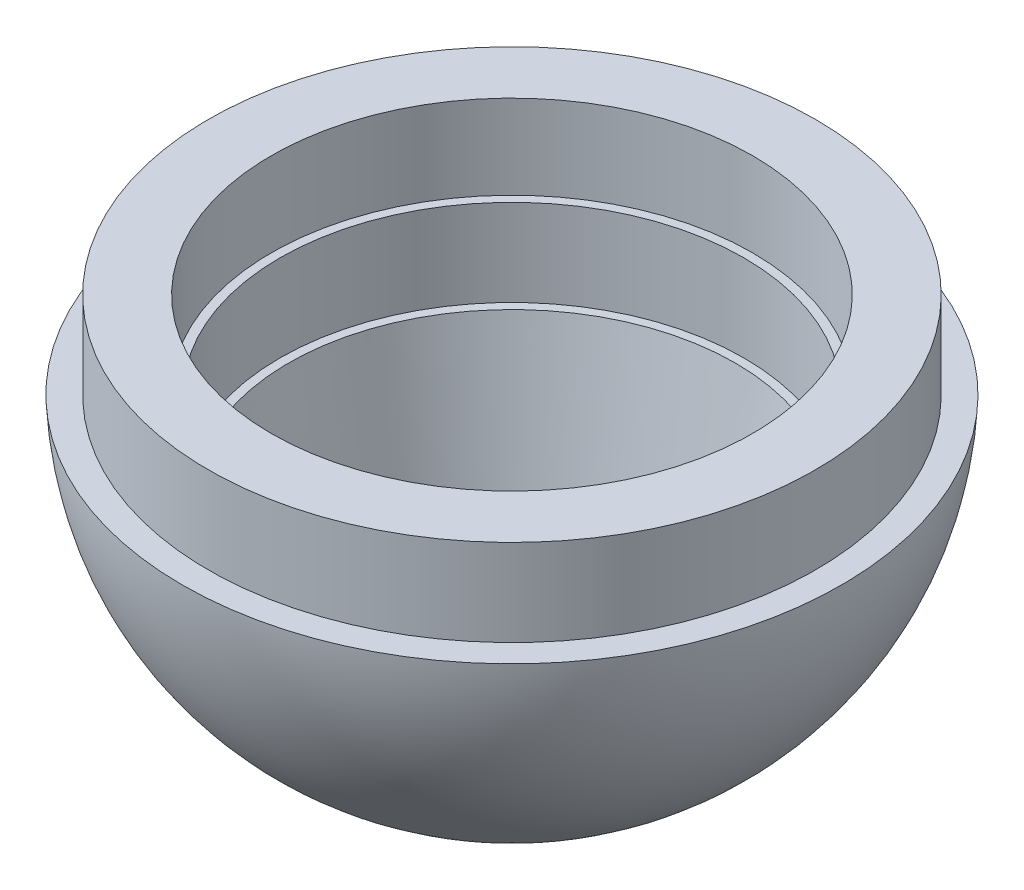
ISO-10303-21;
HEADER;
FILE_DESCRIPTION(('STEP AP214'),'2;1');
FILE_NAME('part.step','',(''),(''),'','','');
FILE_SCHEMA(('AUTOMOTIVE_DESIGN { 1 0 10303 214 1 1 1 1 }'));
ENDSEC;
DATA;
#1=APPLICATION_CONTEXT('core data for automotive mechanical design processes');
#2=APPLICATION_PROTOCOL_DEFINITION('international standard','automotive_design',2000,#1);
#3=PRODUCT_CONTEXT('',#1,'mechanical');
#4=PRODUCT('Part','Part','',(#3));
#5=PRODUCT_RELATED_PRODUCT_CATEGORY('part','',(#4));
#6=PRODUCT_DEFINITION_FORMATION('','',#4);
#7=PRODUCT_DEFINITION_CONTEXT('part definition',#1,'design');
#8=PRODUCT_DEFINITION('design','',#6,#7);
#9=PRODUCT_DEFINITION_SHAPE('','',#8);
#10=(LENGTH_UNIT() NAMED_UNIT(*) SI_UNIT(.MILLI.,.METRE.));
#11=(NAMED_UNIT(*) PLANE_ANGLE_UNIT() SI_UNIT($,.RADIAN.));
#12=(NAMED_UNIT(*) SI_UNIT($,.STERADIAN.) SOLID_ANGLE_UNIT());
#13=UNCERTAINTY_MEASURE_WITH_UNIT(LENGTH_MEASURE(1.E-05),#10,'distance_accuracy_value','');
#14=(GEOMETRIC_REPRESENTATION_CONTEXT(3) GLOBAL_UNCERTAINTY_ASSIGNED_CONTEXT((#13)) GLOBAL_UNIT_ASSIGNED_CONTEXT((#10,
#11,#12)) REPRESENTATION_CONTEXT('',''));
#15=CARTESIAN_POINT('',(0.,0.,0.));
#16=DIRECTION('',(0.,0.,1.));
#17=DIRECTION('',(1.,0.,0.));
#18=AXIS2_PLACEMENT_3D('',#15,#16,#17);
#19=CARTESIAN_POINT('',(0.,0.,0.));
#20=DIRECTION('',(0.,-1.,0.));
#21=DIRECTION('',(0.,0.,-1.));
#22=AXIS2_PLACEMENT_3D('',#19,#20,#21);
#23=CYLINDRICAL_SURFACE('',#22,27.75);
#24=CARTESIAN_POINT('',(0.,8.2,0.));
#25=DIRECTION('',(0.,-1.,0.));
#26=DIRECTION('',(0.,0.,-1.));
#27=AXIS2_PLACEMENT_3D('',#24,#25,#26);
#28=CIRCLE('',#27,27.75);
#29=CARTESIAN_POINT('',(0.,8.2,-27.75));
#30=VERTEX_POINT('',#29);
#31=EDGE_CURVE('E68',#30,#30,#28,.T.);
#32=ORIENTED_EDGE('',*,*,#31,.F.);
#33=EDGE_LOOP('',(#32));
#34=FACE_BOUND('',#33,.T.);
#35=CARTESIAN_POINT('',(0.,-1.5,0.));
#36=DIRECTION('',(0.,-1.,0.));
#37=DIRECTION('',(0.,0.,-1.));
#38=AXIS2_PLACEMENT_3D('',#35,#36,#37);
#39=CIRCLE('',#38,27.75);
#40=CARTESIAN_POINT('',(0.,-1.5,-27.75));
#41=VERTEX_POINT('',#40);
#42=EDGE_CURVE('E10',#41,#41,#39,.T.);
#43=ORIENTED_EDGE('',*,*,#42,.T.);
#44=EDGE_LOOP('',(#43));
#45=FACE_BOUND('',#44,.T.);
#46=ADVANCED_FACE('F31',(#34,#45),#23,.F.);
#47=CARTESIAN_POINT('',(0.,-1.5,27.75));
#48=DIRECTION('',(0.,-1.,0.));
#49=DIRECTION('',(0.,0.,-1.));
#50=AXIS2_PLACEMENT_3D('',#47,#48,#49);
#51=PLANE('',#50);
#52=ORIENTED_EDGE('',*,*,#42,.F.);
#53=EDGE_LOOP('',(#52));
#54=FACE_BOUND('',#53,.T.);
#55=CARTESIAN_POINT('',(0.,-1.5,0.));
#56=DIRECTION('',(0.,-1.,0.));
#57=DIRECTION('',(0.,0.,-1.));
#58=AXIS2_PLACEMENT_3D('',#55,#56,#57);
#59=CIRCLE('',#58,26.75);
#60=CARTESIAN_POINT('',(0.,-1.5,-26.75));
#61=VERTEX_POINT('',#60);
#62=EDGE_CURVE('E37',#61,#61,#59,.T.);
#63=ORIENTED_EDGE('',*,*,#62,.T.);
#64=EDGE_LOOP('',(#63));
#65=FACE_BOUND('',#64,.T.);
#66=ADVANCED_FACE('F75',(#54,#65),#51,.F.);
#67=CARTESIAN_POINT('',(0.,0.,0.));
#68=DIRECTION('',(0.,-1.,0.));
#69=DIRECTION('',(0.,0.,-1.));
#70=AXIS2_PLACEMENT_3D('',#67,#68,#69);
#71=CYLINDRICAL_SURFACE('',#70,26.75);
#72=ORIENTED_EDGE('',*,*,#62,.F.);
#73=EDGE_LOOP('',(#72));
#74=FACE_BOUND('',#73,.T.);
#75=CARTESIAN_POINT('',(0.,-11.5,0.));
#76=DIRECTION('',(0.,-1.,0.));
#77=DIRECTION('',(0.,0.,-1.));
#78=AXIS2_PLACEMENT_3D('',#75,#76,#77);
#79=CIRCLE('',#78,26.75);
#80=CARTESIAN_POINT('',(0.,-11.5,-26.75));
#81=VERTEX_POINT('',#80);
#82=EDGE_CURVE('E41',#81,#81,#79,.T.);
#83=ORIENTED_EDGE('',*,*,#82,.T.);
#84=EDGE_LOOP('',(#83));
#85=FACE_BOUND('',#84,.T.);
#86=ADVANCED_FACE('F79',(#74,#85),#71,.F.);
#87=CARTESIAN_POINT('',(0.,-11.5,26.75));
#88=DIRECTION('',(0.,-1.,0.));
#89=DIRECTION('',(0.,0.,-1.));
#90=AXIS2_PLACEMENT_3D('',#87,#88,#89);
#91=PLANE('',#90);
#92=ORIENTED_EDGE('',*,*,#82,.F.);
#93=EDGE_LOOP('',(#92));
#94=FACE_BOUND('',#93,.T.);
#95=CARTESIAN_POINT('',(0.,-11.5,0.));
#96=DIRECTION('',(0.,-1.,0.));
#97=DIRECTION('',(0.,0.,-1.));
#98=AXIS2_PLACEMENT_3D('',#95,#96,#97);
#99=CIRCLE('',#98,25.75);
#100=CARTESIAN_POINT('',(0.,-11.5,-25.75));
#101=VERTEX_POINT('',#100);
#102=EDGE_CURVE('E45',#101,#101,#99,.T.);
#103=ORIENTED_EDGE('',*,*,#102,.T.);
#104=EDGE_LOOP('',(#103));
#105=FACE_BOUND('',#104,.T.);
#106=ADVANCED_FACE('F84',(#94,#105),#91,.F.);
#107=CARTESIAN_POINT('',(0.,-28.2472963553339,0.));
#108=DIRECTION('',(0.,1.,0.));
#109=DIRECTION('',(0.,0.,1.));
#110=AXIS2_PLACEMENT_3D('',#107,#108,#109);
#111=CONICAL_SURFACE('',#110,22.7969997986341,0.174532925199434);
#112=ORIENTED_EDGE('',*,*,#102,.F.);
#113=EDGE_LOOP('',(#112));
#114=FACE_BOUND('',#113,.T.);
#115=CARTESIAN_POINT('',(0.,-28.2472963553339,0.));
#116=DIRECTION('',(0.,-1.,0.));
#117=DIRECTION('',(0.,0.,-1.));
#118=AXIS2_PLACEMENT_3D('',#115,#116,#117);
#119=CIRCLE('',#118,22.7969997986341);
#120=CARTESIAN_POINT('',(0.,-28.2472963553339,-22.7969997986341));
#121=VERTEX_POINT('',#120);
#122=EDGE_CURVE('E50',#121,#121,#119,.T.);
#123=ORIENTED_EDGE('',*,*,#122,.T.);
#124=EDGE_LOOP('',(#123));
#125=FACE_BOUND('',#124,.T.);
#126=ADVANCED_FACE('F90',(#114,#125),#111,.F.);
#127=CARTESIAN_POINT('',(0.,-27.9,0.));
#128=DIRECTION('',(0.,-1.,0.));
#129=DIRECTION('',(0.,0.,-1.));
#130=AXIS2_PLACEMENT_3D('',#127,#128,#129);
#131=TOROIDAL_SURFACE('',#130,20.8273842926097,2.);
#132=ORIENTED_EDGE('',*,*,#122,.F.);
#133=EDGE_LOOP('',(#132));
#134=FACE_BOUND('',#133,.T.);
#135=CARTESIAN_POINT('',(0.,-29.9,0.));
#136=DIRECTION('',(0.,-1.,0.));
#137=DIRECTION('',(0.,0.,-1.));
#138=AXIS2_PLACEMENT_3D('',#135,#136,#137);
#139=CIRCLE('',#138,20.8273842926097);
#140=CARTESIAN_POINT('',(0.,-29.9,-20.8273842926097));
#141=VERTEX_POINT('',#140);
#142=EDGE_CURVE('E53',#141,#141,#139,.T.);
#143=ORIENTED_EDGE('',*,*,#142,.T.);
#144=EDGE_LOOP('',(#143));
#145=FACE_BOUND('',#144,.T.);
#146=ADVANCED_FACE('F94',(#134,#145),#131,.F.);
#147=CARTESIAN_POINT('',(0.,-29.9,20.8273842926097));
#148=DIRECTION('',(0.,-1.,0.));
#149=DIRECTION('',(0.,0.,-1.));
#150=AXIS2_PLACEMENT_3D('',#147,#148,#149);
#151=PLANE('',#150);
#152=ORIENTED_EDGE('',*,*,#142,.F.);
#153=EDGE_LOOP('',(#152));
#154=FACE_BOUND('',#153,.T.);
#155=ADVANCED_FACE('F98',(#154),#151,.F.);
#156=CARTESIAN_POINT('',(0.,-32.4,19.9369004612051));
#157=DIRECTION('',(0.,1.,0.));
#158=DIRECTION('',(0.,0.,1.));
#159=AXIS2_PLACEMENT_3D('',#156,#157,#158);
#160=PLANE('',#159);
#161=CARTESIAN_POINT('',(0.,-32.4,0.));
#162=DIRECTION('',(0.,-1.,0.));
#163=DIRECTION('',(0.,0.,-1.));
#164=AXIS2_PLACEMENT_3D('',#161,#162,#163);
#165=CIRCLE('',#164,19.9369004612051);
#166=CARTESIAN_POINT('',(0.,-32.4,19.9369004612051));
#167=VERTEX_POINT('',#166);
#168=EDGE_CURVE('E56',#167,#167,#165,.T.);
#169=ORIENTED_EDGE('',*,*,#168,.T.);
#170=EDGE_LOOP('',(#169));
#171=FACE_BOUND('',#170,.T.);
#172=ADVANCED_FACE('F102',(#171),#160,.F.);
#173=CARTESIAN_POINT('',(0.,0.,0.));
#174=DIRECTION('',(0.,-1.,0.));
#175=DIRECTION('',(0.,0.,1.));
#176=AXIS2_PLACEMENT_3D('',#173,#174,#175);
#177=SPHERICAL_SURFACE('',#176,38.0426076919025);
#178=CARTESIAN_POINT('',(0.,-1.80000000000002,0.));
#179=DIRECTION('',(0.,-1.,0.));
#180=DIRECTION('',(0.,0.,-1.));
#181=AXIS2_PLACEMENT_3D('',#178,#179,#180);
#182=CIRCLE('',#181,38.);
#183=CARTESIAN_POINT('',(0.,-1.80000000000002,38.));
#184=VERTEX_POINT('',#183);
#185=EDGE_CURVE('E59',#184,#184,#182,.T.);
#186=CARTESIAN_POINT('',(0.,-32.4,19.9369004612051));
#187=CARTESIAN_POINT('',(0.,-32.19817305489,20.2648986217288));
#188=CARTESIAN_POINT('',(0.,-31.9913622716428,20.5898299254452));
#189=CARTESIAN_POINT('',(0.,-31.5679708710208,21.2332638202344));
#190=CARTESIAN_POINT('',(0.,-31.351390253646,21.5517664113071));
#191=CARTESIAN_POINT('',(0.,-30.9086570269157,22.1820478817799));
#192=CARTESIAN_POINT('',(0.,-30.6825044175602,22.4938267611798));
#193=CARTESIAN_POINT('',(0.,-30.2208362913392,23.110373599047));
#194=CARTESIAN_POINT('',(0.,-29.9853207744736,23.4151415575142));
#195=CARTESIAN_POINT('',(0.,-29.5051439059312,24.0173853845485));
#196=CARTESIAN_POINT('',(0.,-29.2604825542543,24.3148612531156));
#197=CARTESIAN_POINT('',(0.,-28.7622396970791,24.9022465707359));
#198=CARTESIAN_POINT('',(0.,-28.5086581915806,25.192156019789));
#199=CARTESIAN_POINT('',(0.,-27.9928088881149,25.764141116503));
#200=CARTESIAN_POINT('',(0.,-27.7305410901475,26.0462167641638));
#201=CARTESIAN_POINT('',(0.,-27.1975610866679,26.6022741093012));
#202=CARTESIAN_POINT('',(0.,-26.9268488811555,26.8762558067777));
#203=CARTESIAN_POINT('',(0.,-26.3772297322171,27.415872565385));
#204=CARTESIAN_POINT('',(0.,-26.0983227887911,27.6815076265159));
#205=CARTESIAN_POINT('',(0.,-25.5325713923291,28.2041861247293));
#206=CARTESIAN_POINT('',(0.,-25.2457269392931,28.4612295618118));
#207=CARTESIAN_POINT('',(0.,-24.6643650722196,28.966487747884));
#208=CARTESIAN_POINT('',(0.,-24.3698476581822,29.2147024968736));
#209=CARTESIAN_POINT('',(0.,-23.7734114943371,29.7020743852112));
#210=CARTESIAN_POINT('',(0.,-23.4714927445294,29.9412315245592));
#211=CARTESIAN_POINT('',(0.,-22.8605323604038,30.4102676256346));
#212=CARTESIAN_POINT('',(0.,-22.551490726086,30.6401465873621));
#213=CARTESIAN_POINT('',(0.,-21.926569593443,31.0904143222259));
#214=CARTESIAN_POINT('',(0.,-21.6106900951178,31.3108030953622));
#215=CARTESIAN_POINT('',(0.,-20.9723845613337,31.7418871946093));
#216=CARTESIAN_POINT('',(0.,-20.6499585258747,31.95258252072));
#217=CARTESIAN_POINT('',(0.,-19.9988572823857,32.3640854074781));
#218=CARTESIAN_POINT('',(0.,-19.6701820743557,32.5648929681254));
#219=CARTESIAN_POINT('',(0.,-19.0068856137254,32.9564351247299));
#220=CARTESIAN_POINT('',(0.,-18.6722643611251,33.147169720687));
#221=CARTESIAN_POINT('',(0.,-17.9973844232266,33.5183900386992));
#222=CARTESIAN_POINT('',(0.,-17.6571257379283,33.6988757607544));
#223=CARTESIAN_POINT('',(0.,-16.9712847457533,34.0494318740024));
#224=CARTESIAN_POINT('',(0.,-16.6257024388766,34.2195022651952));
#225=CARTESIAN_POINT('',(0.,-15.9295329244925,34.5490708655282));
#226=CARTESIAN_POINT('',(0.,-15.5789457169851,34.7085690746683));
#227=CARTESIAN_POINT('',(0.,-14.8730897381678,35.0168462101338));
#228=CARTESIAN_POINT('',(0.,-14.517820966858,35.165625136459));
#229=CARTESIAN_POINT('',(0.,-13.8029295149404,35.4523264916342));
#230=CARTESIAN_POINT('',(0.,-13.4433068343328,35.5902489204841));
#231=CARTESIAN_POINT('',(0.,-12.7200392338122,35.8551100786733));
#232=CARTESIAN_POINT('',(0.,-12.3563943138993,35.9820488080125));
#233=CARTESIAN_POINT('',(0.,-11.6254176143661,36.2248254951819));
#234=CARTESIAN_POINT('',(0.,-11.2580858347459,36.340663453012));
#235=CARTESIAN_POINT('',(0.,-10.5200741956618,36.5611317628121));
#236=CARTESIAN_POINT('',(0.,-10.149394336198,36.6657621147819));
#237=CARTESIAN_POINT('',(0.,-9.40502840521446,36.8637187160395));
#238=CARTESIAN_POINT('',(0.,-9.03134233369479,36.9570449653272));
#239=CARTESIAN_POINT('',(0.,-8.28130861862321,37.1323072858782));
#240=CARTESIAN_POINT('',(0.,-7.9049609750713,37.2142433571416));
#241=CARTESIAN_POINT('',(0.,-7.14995121180912,37.366649765999));
#242=CARTESIAN_POINT('',(0.,-6.77128909209885,37.4371201035931));
#243=CARTESIAN_POINT('',(0.,-6.01199960265488,37.566530008562));
#244=CARTESIAN_POINT('',(0.,-5.63137223292116,37.6254695759367));
#245=CARTESIAN_POINT('',(0.,-4.86850329816804,37.7317637453022));
#246=CARTESIAN_POINT('',(0.,-4.48626173314862,37.779118347293));
#247=CARTESIAN_POINT('',(0.,-3.72051689117553,37.8621983031418));
#248=CARTESIAN_POINT('',(0.,-3.33701361422185,37.8979236569999));
#249=CARTESIAN_POINT('',(0.,-2.56909921972093,37.9577144405914));
#250=CARTESIAN_POINT('',(0.,-2.18468810217369,37.9817798703248));
#251=CARTESIAN_POINT('',(0.,-1.80000000000002,38.));
#252=B_SPLINE_CURVE_WITH_KNOTS('',3,(#186,#187,#188,#189,#190,#191,#192,#193,#194,#195,#196,
#197,#198,#199,#200,#201,#202,#203,#204,#205,#206,#207,#208,#209,#210,#211,#212,#213,#214,#215,
#216,#217,#218,#219,#220,#221,#222,#223,#224,#225,#226,#227,#228,#229,#230,#231,#232,#233,#234,
#235,#236,#237,#238,#239,#240,#241,#242,#243,#244,#245,#246,#247,#248,#249,#250,#251),
.UNSPECIFIED.,.F.,.F.,(4,2,2,2,2,2,2,2,2,2,2,2,2,2,2,2,2,2,2,2,2,2,2,2,2,2,2,2,2,2,2,2,4),(0.,
1.15531345981755,2.31062691963511,3.46594037945266,4.62125383927022,5.77656729908777,
6.93188075890533,8.08719421872288,9.24250767854044,10.397821138358,11.5531345981755,
12.7084480579931,13.8637615178107,15.0190749776282,16.1743884374458,17.3297018972633,
18.4850153570809,19.6403288168984,20.795642276716,21.9509557365335,23.1062691963511,
24.2615826561687,25.4168961159862,26.5722095758038,27.7275230356213,28.8828364954389,
30.0381499552564,31.193463415074,32.3487768748915,33.5040903347091,34.6594037945267,
35.8147172543442,36.9700307141618),.UNSPECIFIED.);
#253=EDGE_CURVE('BSEAM106',#167,#184,#252,.T.);
#254=ORIENTED_EDGE('',*,*,#168,.F.);
#255=ORIENTED_EDGE('',*,*,#185,.T.);
#256=ORIENTED_EDGE('',*,*,#253,.T.);
#257=ORIENTED_EDGE('',*,*,#253,.F.);
#258=EDGE_LOOP('',(#254,#256,#255,#257));
#259=FACE_BOUND('',#258,.T.);
#260=ADVANCED_FACE('F106',(#259),#177,.T.);
#261=CARTESIAN_POINT('',(0.,-1.80000000000001,35.));
#262=DIRECTION('',(0.,-1.,0.));
#263=DIRECTION('',(0.,0.,-1.));
#264=AXIS2_PLACEMENT_3D('',#261,#262,#263);
#265=PLANE('',#264);
#266=ORIENTED_EDGE('',*,*,#185,.F.);
#267=EDGE_LOOP('',(#266));
#268=FACE_BOUND('',#267,.T.);
#269=CARTESIAN_POINT('',(0.,-1.80000000000001,0.));
#270=DIRECTION('',(0.,-1.,0.));
#271=DIRECTION('',(0.,0.,-1.));
#272=AXIS2_PLACEMENT_3D('',#269,#270,#271);
#273=CIRCLE('',#272,35.);
#274=CARTESIAN_POINT('',(0.,-1.80000000000001,-35.));
#275=VERTEX_POINT('',#274);
#276=EDGE_CURVE('E62',#275,#275,#273,.T.);
#277=ORIENTED_EDGE('',*,*,#276,.T.);
#278=EDGE_LOOP('',(#277));
#279=FACE_BOUND('',#278,.T.);
#280=ADVANCED_FACE('F110',(#268,#279),#265,.F.);
#281=CARTESIAN_POINT('',(0.,0.,0.));
#282=DIRECTION('',(0.,-1.,0.));
#283=DIRECTION('',(0.,0.,-1.));
#284=AXIS2_PLACEMENT_3D('',#281,#282,#283);
#285=CYLINDRICAL_SURFACE('',#284,35.);
#286=ORIENTED_EDGE('',*,*,#276,.F.);
#287=EDGE_LOOP('',(#286));
#288=FACE_BOUND('',#287,.T.);
#289=CARTESIAN_POINT('',(0.,8.19999999999999,0.));
#290=DIRECTION('',(0.,-1.,0.));
#291=DIRECTION('',(0.,0.,-1.));
#292=AXIS2_PLACEMENT_3D('',#289,#290,#291);
#293=CIRCLE('',#292,35.);
#294=CARTESIAN_POINT('',(0.,8.19999999999999,-35.));
#295=VERTEX_POINT('',#294);
#296=EDGE_CURVE('E65',#295,#295,#293,.T.);
#297=ORIENTED_EDGE('',*,*,#296,.T.);
#298=EDGE_LOOP('',(#297));
#299=FACE_BOUND('',#298,.T.);
#300=ADVANCED_FACE('F114',(#288,#299),#285,.T.);
#301=CARTESIAN_POINT('',(0.,8.2,27.75));
#302=DIRECTION('',(0.,-1.,0.));
#303=DIRECTION('',(0.,0.,-1.));
#304=AXIS2_PLACEMENT_3D('',#301,#302,#303);
#305=PLANE('',#304);
#306=ORIENTED_EDGE('',*,*,#296,.F.);
#307=EDGE_LOOP('',(#306));
#308=FACE_BOUND('',#307,.T.);
#309=ORIENTED_EDGE('',*,*,#31,.T.);
#310=EDGE_LOOP('',(#309));
#311=FACE_BOUND('',#310,.T.);
#312=ADVANCED_FACE('F72',(#308,#311),#305,.F.);
#313=CLOSED_SHELL('',(#46,#66,#86,#106,#126,#146,#155,#172,#260,#280,#300,#312));
#314=MANIFOLD_SOLID_BREP('B2',#313);
#315=ADVANCED_BREP_SHAPE_REPRESENTATION('',(#18,#314),#14);
#316=SHAPE_DEFINITION_REPRESENTATION(#9,#315);
ENDSEC;
END-ISO-10303-21;
